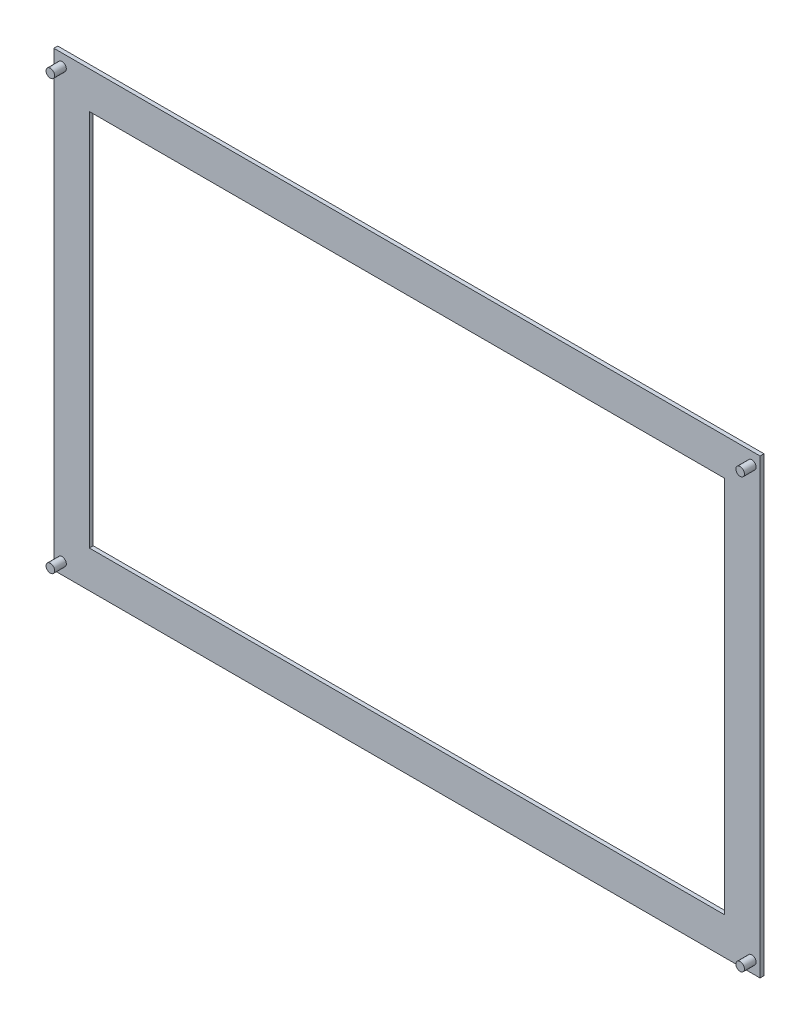
ISO-10303-21;
HEADER;
FILE_DESCRIPTION(('STEP AP214'),'2;1');
FILE_NAME('part.step','',(''),(''),'','','');
FILE_SCHEMA(('AUTOMOTIVE_DESIGN { 1 0 10303 214 1 1 1 1 }'));
ENDSEC;
DATA;
#1=APPLICATION_CONTEXT('core data for automotive mechanical design processes');
#2=APPLICATION_PROTOCOL_DEFINITION('international standard','automotive_design',2000,#1);
#3=PRODUCT_CONTEXT('',#1,'mechanical');
#4=PRODUCT('Part','Part','',(#3));
#5=PRODUCT_RELATED_PRODUCT_CATEGORY('part','',(#4));
#6=PRODUCT_DEFINITION_FORMATION('','',#4);
#7=PRODUCT_DEFINITION_CONTEXT('part definition',#1,'design');
#8=PRODUCT_DEFINITION('design','',#6,#7);
#9=PRODUCT_DEFINITION_SHAPE('','',#8);
#10=(LENGTH_UNIT() NAMED_UNIT(*) SI_UNIT(.MILLI.,.METRE.));
#11=(NAMED_UNIT(*) PLANE_ANGLE_UNIT() SI_UNIT($,.RADIAN.));
#12=(NAMED_UNIT(*) SI_UNIT($,.STERADIAN.) SOLID_ANGLE_UNIT());
#13=UNCERTAINTY_MEASURE_WITH_UNIT(LENGTH_MEASURE(1.E-05),#10,'distance_accuracy_value','');
#14=(GEOMETRIC_REPRESENTATION_CONTEXT(3) GLOBAL_UNCERTAINTY_ASSIGNED_CONTEXT((#13)) GLOBAL_UNIT_ASSIGNED_CONTEXT((#10,
#11,#12)) REPRESENTATION_CONTEXT('',''));
#15=CARTESIAN_POINT('',(0.,0.,0.));
#16=DIRECTION('',(0.,0.,1.));
#17=DIRECTION('',(1.,0.,0.));
#18=AXIS2_PLACEMENT_3D('',#15,#16,#17);
#19=CARTESIAN_POINT('',(90.5999999999999,58.,1.));
#20=DIRECTION('',(-1.,0.,0.));
#21=DIRECTION('',(0.,-1.,0.));
#22=AXIS2_PLACEMENT_3D('',#19,#20,#21);
#23=PLANE('',#22);
#24=DIRECTION('',(0.,1.,0.));
#25=VECTOR('',#24,1.);
#26=CARTESIAN_POINT('',(90.5999999999999,58.,0.));
#27=LINE('',#26,#25);
#28=CARTESIAN_POINT('',(90.6,-58.,0.));
#29=VERTEX_POINT('',#28);
#30=CARTESIAN_POINT('',(90.5999999999999,58.,0.));
#31=VERTEX_POINT('',#30);
#32=EDGE_CURVE('E136',#29,#31,#27,.T.);
#33=ORIENTED_EDGE('',*,*,#32,.T.);
#34=DIRECTION('',(0.,0.,-1.));
#35=VECTOR('',#34,1.);
#36=CARTESIAN_POINT('',(90.5999999999999,58.,1.));
#37=LINE('',#36,#35);
#38=CARTESIAN_POINT('',(90.5999999999999,58.,1.));
#39=VERTEX_POINT('',#38);
#40=EDGE_CURVE('E11',#39,#31,#37,.T.);
#41=ORIENTED_EDGE('',*,*,#40,.F.);
#42=DIRECTION('',(0.,1.,0.));
#43=VECTOR('',#42,1.);
#44=CARTESIAN_POINT('',(90.5999999999999,58.,1.));
#45=LINE('',#44,#43);
#46=CARTESIAN_POINT('',(90.6,-58.,1.));
#47=VERTEX_POINT('',#46);
#48=EDGE_CURVE('E140',#47,#39,#45,.T.);
#49=ORIENTED_EDGE('',*,*,#48,.F.);
#50=DIRECTION('',(0.,0.,-1.));
#51=VECTOR('',#50,1.);
#52=CARTESIAN_POINT('',(90.6,-58.,1.));
#53=LINE('',#52,#51);
#54=EDGE_CURVE('E150',#47,#29,#53,.T.);
#55=ORIENTED_EDGE('',*,*,#54,.T.);
#56=EDGE_LOOP('',(#33,#41,#49,#55));
#57=FACE_BOUND('',#56,.T.);
#58=ADVANCED_FACE('F35',(#57),#23,.F.);
#59=CARTESIAN_POINT('',(-90.6000000000001,58.,1.));
#60=DIRECTION('',(0.,-1.,0.));
#61=DIRECTION('',(0.,0.,-1.));
#62=AXIS2_PLACEMENT_3D('',#59,#60,#61);
#63=PLANE('',#62);
#64=DIRECTION('',(-1.,0.,0.));
#65=VECTOR('',#64,1.);
#66=CARTESIAN_POINT('',(-90.6000000000001,58.,0.));
#67=LINE('',#66,#65);
#68=CARTESIAN_POINT('',(-90.6000000000001,58.,0.));
#69=VERTEX_POINT('',#68);
#70=EDGE_CURVE('E153',#31,#69,#67,.T.);
#71=ORIENTED_EDGE('',*,*,#70,.T.);
#72=DIRECTION('',(0.,0.,-1.));
#73=VECTOR('',#72,1.);
#74=CARTESIAN_POINT('',(-90.6000000000001,58.,1.));
#75=LINE('',#74,#73);
#76=CARTESIAN_POINT('',(-90.6000000000001,58.,1.));
#77=VERTEX_POINT('',#76);
#78=EDGE_CURVE('E42',#77,#69,#75,.T.);
#79=ORIENTED_EDGE('',*,*,#78,.F.);
#80=DIRECTION('',(-1.,0.,0.));
#81=VECTOR('',#80,1.);
#82=CARTESIAN_POINT('',(-90.6000000000001,58.,1.));
#83=LINE('',#82,#81);
#84=EDGE_CURVE('E143',#39,#77,#83,.T.);
#85=ORIENTED_EDGE('',*,*,#84,.F.);
#86=ORIENTED_EDGE('',*,*,#40,.T.);
#87=EDGE_LOOP('',(#71,#79,#85,#86));
#88=FACE_BOUND('',#87,.T.);
#89=ADVANCED_FACE('F181',(#88),#63,.F.);
#90=CARTESIAN_POINT('',(-90.6000000000001,58.,1.));
#91=DIRECTION('',(1.,0.,0.));
#92=DIRECTION('',(0.,1.,0.));
#93=AXIS2_PLACEMENT_3D('',#90,#91,#92);
#94=PLANE('',#93);
#95=DIRECTION('',(0.,-1.,0.));
#96=VECTOR('',#95,1.);
#97=CARTESIAN_POINT('',(-90.6000000000001,58.,0.));
#98=LINE('',#97,#96);
#99=CARTESIAN_POINT('',(-90.6,-58.,0.));
#100=VERTEX_POINT('',#99);
#101=EDGE_CURVE('E155',#69,#100,#98,.T.);
#102=ORIENTED_EDGE('',*,*,#101,.T.);
#103=DIRECTION('',(0.,0.,-1.));
#104=VECTOR('',#103,1.);
#105=CARTESIAN_POINT('',(-90.6,-58.,1.));
#106=LINE('',#105,#104);
#107=CARTESIAN_POINT('',(-90.6,-58.,1.));
#108=VERTEX_POINT('',#107);
#109=EDGE_CURVE('E160',#108,#100,#106,.T.);
#110=ORIENTED_EDGE('',*,*,#109,.F.);
#111=DIRECTION('',(0.,-1.,0.));
#112=VECTOR('',#111,1.);
#113=CARTESIAN_POINT('',(-90.6000000000001,58.,1.));
#114=LINE('',#113,#112);
#115=EDGE_CURVE('E146',#77,#108,#114,.T.);
#116=ORIENTED_EDGE('',*,*,#115,.F.);
#117=ORIENTED_EDGE('',*,*,#78,.T.);
#118=EDGE_LOOP('',(#102,#110,#116,#117));
#119=FACE_BOUND('',#118,.T.);
#120=ADVANCED_FACE('F167',(#119),#94,.F.);
#121=CARTESIAN_POINT('',(-90.6,-58.,1.));
#122=DIRECTION('',(0.,1.,0.));
#123=DIRECTION('',(0.,0.,1.));
#124=AXIS2_PLACEMENT_3D('',#121,#122,#123);
#125=PLANE('',#124);
#126=DIRECTION('',(1.,0.,0.));
#127=VECTOR('',#126,1.);
#128=CARTESIAN_POINT('',(-90.6,-58.,0.));
#129=LINE('',#128,#127);
#130=EDGE_CURVE('E144',#100,#29,#129,.T.);
#131=ORIENTED_EDGE('',*,*,#130,.T.);
#132=ORIENTED_EDGE('',*,*,#54,.F.);
#133=DIRECTION('',(1.,0.,0.));
#134=VECTOR('',#133,1.);
#135=CARTESIAN_POINT('',(-90.6,-58.,1.));
#136=LINE('',#135,#134);
#137=EDGE_CURVE('E148',#108,#47,#136,.T.);
#138=ORIENTED_EDGE('',*,*,#137,.F.);
#139=ORIENTED_EDGE('',*,*,#109,.T.);
#140=EDGE_LOOP('',(#131,#132,#138,#139));
#141=FACE_BOUND('',#140,.T.);
#142=ADVANCED_FACE('F174',(#141),#125,.F.);
#143=CARTESIAN_POINT('',(0.,0.,1.));
#144=DIRECTION('',(0.,0.,1.));
#145=DIRECTION('',(1.,0.,0.));
#146=AXIS2_PLACEMENT_3D('',#143,#144,#145);
#147=PLANE('',#146);
#148=CARTESIAN_POINT('',(88.5,55.,1.));
#149=DIRECTION('',(0.,0.,1.));
#150=DIRECTION('',(1.,0.,0.));
#151=AXIS2_PLACEMENT_3D('',#148,#149,#150);
#152=CIRCLE('',#151,1.10000000000001);
#153=CARTESIAN_POINT('',(89.6,55.,1.));
#154=VERTEX_POINT('',#153);
#155=EDGE_CURVE('E244',#154,#154,#152,.T.);
#156=ORIENTED_EDGE('',*,*,#155,.F.);
#157=EDGE_LOOP('',(#156));
#158=FACE_BOUND('',#157,.T.);
#159=CARTESIAN_POINT('',(88.5,-55.,1.));
#160=DIRECTION('',(0.,0.,1.));
#161=DIRECTION('',(1.,0.,0.));
#162=AXIS2_PLACEMENT_3D('',#159,#160,#161);
#163=CIRCLE('',#162,1.10000000000001);
#164=CARTESIAN_POINT('',(89.6,-55.,1.));
#165=VERTEX_POINT('',#164);
#166=EDGE_CURVE('E243',#165,#165,#163,.T.);
#167=ORIENTED_EDGE('',*,*,#166,.F.);
#168=EDGE_LOOP('',(#167));
#169=FACE_BOUND('',#168,.T.);
#170=CARTESIAN_POINT('',(-88.5,-55.,1.));
#171=DIRECTION('',(0.,0.,1.));
#172=DIRECTION('',(1.,0.,0.));
#173=AXIS2_PLACEMENT_3D('',#170,#171,#172);
#174=CIRCLE('',#173,1.10000000000001);
#175=CARTESIAN_POINT('',(-87.4,-55.,1.));
#176=VERTEX_POINT('',#175);
#177=EDGE_CURVE('E253',#176,#176,#174,.T.);
#178=ORIENTED_EDGE('',*,*,#177,.F.);
#179=EDGE_LOOP('',(#178));
#180=FACE_BOUND('',#179,.T.);
#181=CARTESIAN_POINT('',(-88.5,55.,1.));
#182=DIRECTION('',(0.,0.,1.));
#183=DIRECTION('',(1.,0.,0.));
#184=AXIS2_PLACEMENT_3D('',#181,#182,#183);
#185=CIRCLE('',#184,1.10000000000001);
#186=CARTESIAN_POINT('',(-87.4,55.,1.));
#187=VERTEX_POINT('',#186);
#188=EDGE_CURVE('E123',#187,#187,#185,.T.);
#189=ORIENTED_EDGE('',*,*,#188,.F.);
#190=EDGE_LOOP('',(#189));
#191=FACE_BOUND('',#190,.T.);
#192=DIRECTION('',(0.,1.,0.));
#193=VECTOR('',#192,1.);
#194=CARTESIAN_POINT('',(81.5,48.5,1.));
#195=LINE('',#194,#193);
#196=CARTESIAN_POINT('',(81.5,-48.5,1.));
#197=VERTEX_POINT('',#196);
#198=CARTESIAN_POINT('',(81.5,48.5,1.));
#199=VERTEX_POINT('',#198);
#200=EDGE_CURVE('E49',#197,#199,#195,.T.);
#201=ORIENTED_EDGE('',*,*,#200,.F.);
#202=DIRECTION('',(1.,0.,0.));
#203=VECTOR('',#202,1.);
#204=CARTESIAN_POINT('',(-81.5,-48.5,1.));
#205=LINE('',#204,#203);
#206=CARTESIAN_POINT('',(-81.5,-48.5,1.));
#207=VERTEX_POINT('',#206);
#208=EDGE_CURVE('E117',#207,#197,#205,.T.);
#209=ORIENTED_EDGE('',*,*,#208,.F.);
#210=DIRECTION('',(0.,-1.,0.));
#211=VECTOR('',#210,1.);
#212=CARTESIAN_POINT('',(-81.5,48.5,1.));
#213=LINE('',#212,#211);
#214=CARTESIAN_POINT('',(-81.5,48.5,1.));
#215=VERTEX_POINT('',#214);
#216=EDGE_CURVE('E120',#215,#207,#213,.T.);
#217=ORIENTED_EDGE('',*,*,#216,.F.);
#218=DIRECTION('',(-1.,0.,0.));
#219=VECTOR('',#218,1.);
#220=CARTESIAN_POINT('',(-81.5,48.5,1.));
#221=LINE('',#220,#219);
#222=EDGE_CURVE('E129',#199,#215,#221,.T.);
#223=ORIENTED_EDGE('',*,*,#222,.F.);
#224=EDGE_LOOP('',(#201,#209,#217,#223));
#225=FACE_BOUND('',#224,.T.);
#226=ORIENTED_EDGE('',*,*,#48,.T.);
#227=ORIENTED_EDGE('',*,*,#84,.T.);
#228=ORIENTED_EDGE('',*,*,#115,.T.);
#229=ORIENTED_EDGE('',*,*,#137,.T.);
#230=EDGE_LOOP('',(#226,#227,#228,#229));
#231=FACE_BOUND('',#230,.T.);
#232=ADVANCED_FACE('F180',(#158,#169,#180,#191,#225,#231),#147,.T.);
#233=CARTESIAN_POINT('',(0.,0.,0.));
#234=DIRECTION('',(0.,0.,1.));
#235=DIRECTION('',(1.,0.,0.));
#236=AXIS2_PLACEMENT_3D('',#233,#234,#235);
#237=PLANE('',#236);
#238=DIRECTION('',(1.,0.,0.));
#239=VECTOR('',#238,1.);
#240=CARTESIAN_POINT('',(-81.5,-48.5,0.));
#241=LINE('',#240,#239);
#242=CARTESIAN_POINT('',(-81.5,-48.5,0.));
#243=VERTEX_POINT('',#242);
#244=CARTESIAN_POINT('',(81.5,-48.5,0.));
#245=VERTEX_POINT('',#244);
#246=EDGE_CURVE('E107',#243,#245,#241,.T.);
#247=ORIENTED_EDGE('',*,*,#246,.T.);
#248=DIRECTION('',(0.,1.,0.));
#249=VECTOR('',#248,1.);
#250=CARTESIAN_POINT('',(81.5,48.5,0.));
#251=LINE('',#250,#249);
#252=CARTESIAN_POINT('',(81.5,48.5,0.));
#253=VERTEX_POINT('',#252);
#254=EDGE_CURVE('E101',#245,#253,#251,.T.);
#255=ORIENTED_EDGE('',*,*,#254,.T.);
#256=DIRECTION('',(-1.,0.,0.));
#257=VECTOR('',#256,1.);
#258=CARTESIAN_POINT('',(-81.5,48.5,0.));
#259=LINE('',#258,#257);
#260=CARTESIAN_POINT('',(-81.5,48.5,0.));
#261=VERTEX_POINT('',#260);
#262=EDGE_CURVE('E110',#253,#261,#259,.T.);
#263=ORIENTED_EDGE('',*,*,#262,.T.);
#264=DIRECTION('',(0.,-1.,0.));
#265=VECTOR('',#264,1.);
#266=CARTESIAN_POINT('',(-81.5,48.5,0.));
#267=LINE('',#266,#265);
#268=EDGE_CURVE('E57',#261,#243,#267,.T.);
#269=ORIENTED_EDGE('',*,*,#268,.T.);
#270=EDGE_LOOP('',(#247,#255,#263,#269));
#271=FACE_BOUND('',#270,.T.);
#272=ORIENTED_EDGE('',*,*,#32,.F.);
#273=ORIENTED_EDGE('',*,*,#130,.F.);
#274=ORIENTED_EDGE('',*,*,#101,.F.);
#275=ORIENTED_EDGE('',*,*,#70,.F.);
#276=EDGE_LOOP('',(#272,#273,#274,#275));
#277=FACE_BOUND('',#276,.T.);
#278=ADVANCED_FACE('F114',(#271,#277),#237,.F.);
#279=CARTESIAN_POINT('',(81.5,48.5,0.));
#280=DIRECTION('',(1.,0.,0.));
#281=DIRECTION('',(0.,0.,-1.));
#282=AXIS2_PLACEMENT_3D('',#279,#280,#281);
#283=PLANE('',#282);
#284=ORIENTED_EDGE('',*,*,#200,.T.);
#285=DIRECTION('',(0.,0.,1.));
#286=VECTOR('',#285,1.);
#287=CARTESIAN_POINT('',(81.5,48.5,0.));
#288=LINE('',#287,#286);
#289=EDGE_CURVE('E97',#253,#199,#288,.T.);
#290=ORIENTED_EDGE('',*,*,#289,.F.);
#291=ORIENTED_EDGE('',*,*,#254,.F.);
#292=DIRECTION('',(0.,0.,1.));
#293=VECTOR('',#292,1.);
#294=CARTESIAN_POINT('',(81.5,-48.5,0.));
#295=LINE('',#294,#293);
#296=EDGE_CURVE('E134',#245,#197,#295,.T.);
#297=ORIENTED_EDGE('',*,*,#296,.T.);
#298=EDGE_LOOP('',(#284,#290,#291,#297));
#299=FACE_BOUND('',#298,.T.);
#300=ADVANCED_FACE('F99',(#299),#283,.F.);
#301=CARTESIAN_POINT('',(-81.5,-48.5,0.));
#302=DIRECTION('',(0.,-1.,0.));
#303=DIRECTION('',(0.,0.,-1.));
#304=AXIS2_PLACEMENT_3D('',#301,#302,#303);
#305=PLANE('',#304);
#306=ORIENTED_EDGE('',*,*,#208,.T.);
#307=ORIENTED_EDGE('',*,*,#296,.F.);
#308=ORIENTED_EDGE('',*,*,#246,.F.);
#309=DIRECTION('',(0.,0.,1.));
#310=VECTOR('',#309,1.);
#311=CARTESIAN_POINT('',(-81.5,-48.5,0.));
#312=LINE('',#311,#310);
#313=EDGE_CURVE('E137',#243,#207,#312,.T.);
#314=ORIENTED_EDGE('',*,*,#313,.T.);
#315=EDGE_LOOP('',(#306,#307,#308,#314));
#316=FACE_BOUND('',#315,.T.);
#317=ADVANCED_FACE('F198',(#316),#305,.F.);
#318=CARTESIAN_POINT('',(-81.5,48.5,0.));
#319=DIRECTION('',(-1.,0.,0.));
#320=DIRECTION('',(0.,-1.,0.));
#321=AXIS2_PLACEMENT_3D('',#318,#319,#320);
#322=PLANE('',#321);
#323=ORIENTED_EDGE('',*,*,#216,.T.);
#324=ORIENTED_EDGE('',*,*,#313,.F.);
#325=ORIENTED_EDGE('',*,*,#268,.F.);
#326=DIRECTION('',(0.,0.,1.));
#327=VECTOR('',#326,1.);
#328=CARTESIAN_POINT('',(-81.5,48.5,0.));
#329=LINE('',#328,#327);
#330=EDGE_CURVE('E106',#261,#215,#329,.T.);
#331=ORIENTED_EDGE('',*,*,#330,.T.);
#332=EDGE_LOOP('',(#323,#324,#325,#331));
#333=FACE_BOUND('',#332,.T.);
#334=ADVANCED_FACE('F202',(#333),#322,.F.);
#335=CARTESIAN_POINT('',(-81.5,48.5,0.));
#336=DIRECTION('',(0.,1.,0.));
#337=DIRECTION('',(0.,0.,1.));
#338=AXIS2_PLACEMENT_3D('',#335,#336,#337);
#339=PLANE('',#338);
#340=ORIENTED_EDGE('',*,*,#222,.T.);
#341=ORIENTED_EDGE('',*,*,#330,.F.);
#342=ORIENTED_EDGE('',*,*,#262,.F.);
#343=ORIENTED_EDGE('',*,*,#289,.T.);
#344=EDGE_LOOP('',(#340,#341,#342,#343));
#345=FACE_BOUND('',#344,.T.);
#346=ADVANCED_FACE('F111',(#345),#339,.F.);
#347=CARTESIAN_POINT('',(-88.5,55.,4.));
#348=DIRECTION('',(0.,0.,-1.));
#349=DIRECTION('',(-1.,0.,0.));
#350=AXIS2_PLACEMENT_3D('',#347,#348,#349);
#351=CYLINDRICAL_SURFACE('',#350,1.10000000000001);
#352=CARTESIAN_POINT('',(-88.5,55.,4.));
#353=DIRECTION('',(0.,0.,1.));
#354=DIRECTION('',(1.,0.,0.));
#355=AXIS2_PLACEMENT_3D('',#352,#353,#354);
#356=CIRCLE('',#355,1.10000000000001);
#357=CARTESIAN_POINT('',(-87.4,55.,4.));
#358=VERTEX_POINT('',#357);
#359=EDGE_CURVE('E130',#358,#358,#356,.T.);
#360=ORIENTED_EDGE('',*,*,#359,.F.);
#361=EDGE_LOOP('',(#360));
#362=FACE_BOUND('',#361,.T.);
#363=ORIENTED_EDGE('',*,*,#188,.T.);
#364=EDGE_LOOP('',(#363));
#365=FACE_BOUND('',#364,.T.);
#366=ADVANCED_FACE('F201',(#362,#365),#351,.T.);
#367=CARTESIAN_POINT('',(-88.5,55.,4.));
#368=DIRECTION('',(0.,0.,1.));
#369=DIRECTION('',(1.,0.,0.));
#370=AXIS2_PLACEMENT_3D('',#367,#368,#369);
#371=PLANE('',#370);
#372=ORIENTED_EDGE('',*,*,#359,.T.);
#373=EDGE_LOOP('',(#372));
#374=FACE_BOUND('',#373,.T.);
#375=ADVANCED_FACE('F210',(#374),#371,.T.);
#376=CARTESIAN_POINT('',(-88.5,-55.,4.));
#377=DIRECTION('',(0.,0.,-1.));
#378=DIRECTION('',(-1.,0.,0.));
#379=AXIS2_PLACEMENT_3D('',#376,#377,#378);
#380=CYLINDRICAL_SURFACE('',#379,1.10000000000001);
#381=CARTESIAN_POINT('',(-88.5,-55.,4.));
#382=DIRECTION('',(0.,0.,1.));
#383=DIRECTION('',(1.,0.,0.));
#384=AXIS2_PLACEMENT_3D('',#381,#382,#383);
#385=CIRCLE('',#384,1.10000000000001);
#386=CARTESIAN_POINT('',(-87.4,-55.,4.));
#387=VERTEX_POINT('',#386);
#388=EDGE_CURVE('E255',#387,#387,#385,.T.);
#389=ORIENTED_EDGE('',*,*,#388,.F.);
#390=EDGE_LOOP('',(#389));
#391=FACE_BOUND('',#390,.T.);
#392=ORIENTED_EDGE('',*,*,#177,.T.);
#393=EDGE_LOOP('',(#392));
#394=FACE_BOUND('',#393,.T.);
#395=ADVANCED_FACE('F214',(#391,#394),#380,.T.);
#396=CARTESIAN_POINT('',(-88.5,-55.,4.));
#397=DIRECTION('',(0.,0.,1.));
#398=DIRECTION('',(1.,0.,0.));
#399=AXIS2_PLACEMENT_3D('',#396,#397,#398);
#400=PLANE('',#399);
#401=ORIENTED_EDGE('',*,*,#388,.T.);
#402=EDGE_LOOP('',(#401));
#403=FACE_BOUND('',#402,.T.);
#404=ADVANCED_FACE('F218',(#403),#400,.T.);
#405=CARTESIAN_POINT('',(88.5,-55.,4.));
#406=DIRECTION('',(0.,0.,-1.));
#407=DIRECTION('',(-1.,0.,0.));
#408=AXIS2_PLACEMENT_3D('',#405,#406,#407);
#409=CYLINDRICAL_SURFACE('',#408,1.10000000000001);
#410=CARTESIAN_POINT('',(88.5,-55.,4.));
#411=DIRECTION('',(0.,0.,1.));
#412=DIRECTION('',(1.,0.,0.));
#413=AXIS2_PLACEMENT_3D('',#410,#411,#412);
#414=CIRCLE('',#413,1.10000000000001);
#415=CARTESIAN_POINT('',(89.6,-55.,4.));
#416=VERTEX_POINT('',#415);
#417=EDGE_CURVE('E247',#416,#416,#414,.T.);
#418=ORIENTED_EDGE('',*,*,#417,.F.);
#419=EDGE_LOOP('',(#418));
#420=FACE_BOUND('',#419,.T.);
#421=ORIENTED_EDGE('',*,*,#166,.T.);
#422=EDGE_LOOP('',(#421));
#423=FACE_BOUND('',#422,.T.);
#424=ADVANCED_FACE('F222',(#420,#423),#409,.T.);
#425=CARTESIAN_POINT('',(88.5,-55.,4.));
#426=DIRECTION('',(0.,0.,1.));
#427=DIRECTION('',(1.,0.,0.));
#428=AXIS2_PLACEMENT_3D('',#425,#426,#427);
#429=PLANE('',#428);
#430=ORIENTED_EDGE('',*,*,#417,.T.);
#431=EDGE_LOOP('',(#430));
#432=FACE_BOUND('',#431,.T.);
#433=ADVANCED_FACE('F226',(#432),#429,.T.);
#434=CARTESIAN_POINT('',(88.5,55.,4.));
#435=DIRECTION('',(0.,0.,-1.));
#436=DIRECTION('',(-1.,0.,0.));
#437=AXIS2_PLACEMENT_3D('',#434,#435,#436);
#438=CYLINDRICAL_SURFACE('',#437,1.10000000000001);
#439=CARTESIAN_POINT('',(88.5,55.,4.));
#440=DIRECTION('',(0.,0.,1.));
#441=DIRECTION('',(1.,0.,0.));
#442=AXIS2_PLACEMENT_3D('',#439,#440,#441);
#443=CIRCLE('',#442,1.10000000000001);
#444=CARTESIAN_POINT('',(89.6,55.,4.));
#445=VERTEX_POINT('',#444);
#446=EDGE_CURVE('E242',#445,#445,#443,.T.);
#447=ORIENTED_EDGE('',*,*,#446,.F.);
#448=EDGE_LOOP('',(#447));
#449=FACE_BOUND('',#448,.T.);
#450=ORIENTED_EDGE('',*,*,#155,.T.);
#451=EDGE_LOOP('',(#450));
#452=FACE_BOUND('',#451,.T.);
#453=ADVANCED_FACE('F230',(#449,#452),#438,.T.);
#454=CARTESIAN_POINT('',(88.5,55.,4.));
#455=DIRECTION('',(0.,0.,1.));
#456=DIRECTION('',(1.,0.,0.));
#457=AXIS2_PLACEMENT_3D('',#454,#455,#456);
#458=PLANE('',#457);
#459=ORIENTED_EDGE('',*,*,#446,.T.);
#460=EDGE_LOOP('',(#459));
#461=FACE_BOUND('',#460,.T.);
#462=ADVANCED_FACE('F234',(#461),#458,.T.);
#463=CLOSED_SHELL('',(#58,#89,#120,#142,#232,#278,#300,#317,#334,#346,#366,#375,#395,#404,#424,
#433,#453,#462));
#464=MANIFOLD_SOLID_BREP('B2',#463);
#465=ADVANCED_BREP_SHAPE_REPRESENTATION('',(#18,#464),#14);
#466=SHAPE_DEFINITION_REPRESENTATION(#9,#465);
ENDSEC;
END-ISO-10303-21;
